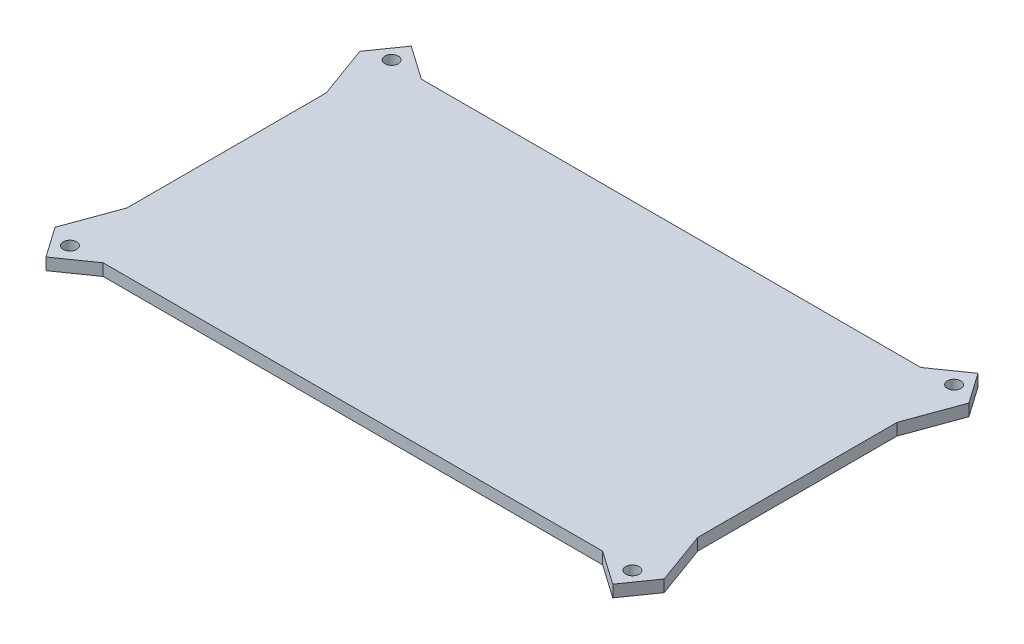
ISO-10303-21;
HEADER;
FILE_DESCRIPTION(('STEP AP214'),'2;1');
FILE_NAME('part.step','',(''),(''),'','','');
FILE_SCHEMA(('AUTOMOTIVE_DESIGN { 1 0 10303 214 1 1 1 1 }'));
ENDSEC;
DATA;
#1=APPLICATION_CONTEXT('core data for automotive mechanical design processes');
#2=APPLICATION_PROTOCOL_DEFINITION('international standard','automotive_design',2000,#1);
#3=PRODUCT_CONTEXT('',#1,'mechanical');
#4=PRODUCT('Part','Part','',(#3));
#5=PRODUCT_RELATED_PRODUCT_CATEGORY('part','',(#4));
#6=PRODUCT_DEFINITION_FORMATION('','',#4);
#7=PRODUCT_DEFINITION_CONTEXT('part definition',#1,'design');
#8=PRODUCT_DEFINITION('design','',#6,#7);
#9=PRODUCT_DEFINITION_SHAPE('','',#8);
#10=(LENGTH_UNIT() NAMED_UNIT(*) SI_UNIT(.MILLI.,.METRE.));
#11=(NAMED_UNIT(*) PLANE_ANGLE_UNIT() SI_UNIT($,.RADIAN.));
#12=(NAMED_UNIT(*) SI_UNIT($,.STERADIAN.) SOLID_ANGLE_UNIT());
#13=UNCERTAINTY_MEASURE_WITH_UNIT(LENGTH_MEASURE(1.E-05),#10,'distance_accuracy_value','');
#14=(GEOMETRIC_REPRESENTATION_CONTEXT(3) GLOBAL_UNCERTAINTY_ASSIGNED_CONTEXT((#13)) GLOBAL_UNIT_ASSIGNED_CONTEXT((#10,
#11,#12)) REPRESENTATION_CONTEXT('',''));
#15=CARTESIAN_POINT('',(0.,0.,0.));
#16=DIRECTION('',(0.,0.,1.));
#17=DIRECTION('',(1.,0.,0.));
#18=AXIS2_PLACEMENT_3D('',#15,#16,#17);
#19=CARTESIAN_POINT('',(0.,0.,0.));
#20=DIRECTION('',(0.,1.,0.));
#21=DIRECTION('',(0.,0.,1.));
#22=AXIS2_PLACEMENT_3D('',#19,#20,#21);
#23=PLANE('',#22);
#24=CARTESIAN_POINT('',(150.291513342091,0.,-85.9398685180908));
#25=DIRECTION('',(0.,-1.,0.));
#26=DIRECTION('',(0.,0.,-1.));
#27=AXIS2_PLACEMENT_3D('',#24,#25,#26);
#28=CIRCLE('',#27,3.57124);
#29=CARTESIAN_POINT('',(150.291513342091,0.,-89.5111085180908));
#30=VERTEX_POINT('',#29);
#31=EDGE_CURVE('E365',#30,#30,#28,.T.);
#32=ORIENTED_EDGE('',*,*,#31,.T.);
#33=EDGE_LOOP('',(#32));
#34=FACE_BOUND('',#33,.T.);
#35=CARTESIAN_POINT('',(-150.291513342091,0.,-85.9398685180908));
#36=DIRECTION('',(0.,-1.,0.));
#37=DIRECTION('',(0.,0.,-1.));
#38=AXIS2_PLACEMENT_3D('',#35,#36,#37);
#39=CIRCLE('',#38,3.57124);
#40=CARTESIAN_POINT('',(-150.291513342091,0.,-89.5111085180908));
#41=VERTEX_POINT('',#40);
#42=EDGE_CURVE('E359',#41,#41,#39,.T.);
#43=ORIENTED_EDGE('',*,*,#42,.T.);
#44=EDGE_LOOP('',(#43));
#45=FACE_BOUND('',#44,.T.);
#46=CARTESIAN_POINT('',(-150.291513342091,0.,85.9398685180908));
#47=DIRECTION('',(0.,-1.,0.));
#48=DIRECTION('',(0.,0.,-1.));
#49=AXIS2_PLACEMENT_3D('',#46,#47,#48);
#50=CIRCLE('',#49,3.57124);
#51=CARTESIAN_POINT('',(-150.291513342091,0.,82.3686285180908));
#52=VERTEX_POINT('',#51);
#53=EDGE_CURVE('E353',#52,#52,#50,.T.);
#54=ORIENTED_EDGE('',*,*,#53,.T.);
#55=EDGE_LOOP('',(#54));
#56=FACE_BOUND('',#55,.T.);
#57=DIRECTION('',(-0.819152044288995,0.,0.573576436351042));
#58=VECTOR('',#57,1.);
#59=CARTESIAN_POINT('',(-133.450000054,0.,85.000000053));
#60=LINE('',#59,#58);
#61=CARTESIAN_POINT('',(-133.450000054,0.,85.000000053));
#62=VERTEX_POINT('',#61);
#63=CARTESIAN_POINT('',(-151.434357400412,0.,97.5927826368149));
#64=VERTEX_POINT('',#63);
#65=EDGE_CURVE('E181',#62,#64,#60,.T.);
#66=ORIENTED_EDGE('',*,*,#65,.F.);
#67=DIRECTION('',(1.,0.,0.));
#68=VECTOR('',#67,1.);
#69=CARTESIAN_POINT('',(-152.500000054,0.,85.000000053));
#70=LINE('',#69,#68);
#71=CARTESIAN_POINT('',(133.450000054,0.,85.000000053));
#72=VERTEX_POINT('',#71);
#73=EDGE_CURVE('E59',#62,#72,#70,.T.);
#74=ORIENTED_EDGE('',*,*,#73,.T.);
#75=DIRECTION('',(-0.819152044288995,0.,-0.573576436351042));
#76=VECTOR('',#75,1.);
#77=CARTESIAN_POINT('',(151.434357400412,0.,97.5927826368149));
#78=LINE('',#77,#76);
#79=CARTESIAN_POINT('',(151.434357400412,0.,97.5927826368149));
#80=VERTEX_POINT('',#79);
#81=EDGE_CURVE('E260',#80,#72,#78,.T.);
#82=ORIENTED_EDGE('',*,*,#81,.F.);
#83=DIRECTION('',(-0.573576436351042,0.,0.819152044288995));
#84=VECTOR('',#83,1.);
#85=CARTESIAN_POINT('',(162.754963749629,0.,81.4252812440682));
#86=LINE('',#85,#84);
#87=CARTESIAN_POINT('',(162.754963749629,0.,81.4252812440682));
#88=VERTEX_POINT('',#87);
#89=EDGE_CURVE('E267',#88,#80,#86,.T.);
#90=ORIENTED_EDGE('',*,*,#89,.F.);
#91=DIRECTION('',(0.342020143325669,0.,0.939692620785908));
#92=VECTOR('',#91,1.);
#93=CARTESIAN_POINT('',(152.500000054,0.,53.250000053));
#94=LINE('',#93,#92);
#95=CARTESIAN_POINT('',(152.500000054,0.,53.250000053));
#96=VERTEX_POINT('',#95);
#97=EDGE_CURVE('E263',#96,#88,#94,.T.);
#98=ORIENTED_EDGE('',*,*,#97,.F.);
#99=DIRECTION('',(0.,0.,-1.));
#100=VECTOR('',#99,1.);
#101=CARTESIAN_POINT('',(152.500000054,0.,-85.000000053));
#102=LINE('',#101,#100);
#103=CARTESIAN_POINT('',(152.500000054,0.,-53.250000053));
#104=VERTEX_POINT('',#103);
#105=EDGE_CURVE('E280',#96,#104,#102,.T.);
#106=ORIENTED_EDGE('',*,*,#105,.T.);
#107=DIRECTION('',(-0.342020143325669,0.,0.939692620785908));
#108=VECTOR('',#107,1.);
#109=CARTESIAN_POINT('',(162.754963749629,0.,-81.4252812440682));
#110=LINE('',#109,#108);
#111=CARTESIAN_POINT('',(162.754963749629,0.,-81.4252812440682));
#112=VERTEX_POINT('',#111);
#113=EDGE_CURVE('E232',#112,#104,#110,.T.);
#114=ORIENTED_EDGE('',*,*,#113,.F.);
#115=DIRECTION('',(0.573576436351042,0.,0.819152044288995));
#116=VECTOR('',#115,1.);
#117=CARTESIAN_POINT('',(151.434357400412,0.,-97.5927826368149));
#118=LINE('',#117,#116);
#119=CARTESIAN_POINT('',(151.434357400412,0.,-97.5927826368149));
#120=VERTEX_POINT('',#119);
#121=EDGE_CURVE('E239',#120,#112,#118,.T.);
#122=ORIENTED_EDGE('',*,*,#121,.F.);
#123=DIRECTION('',(0.819152044288995,0.,-0.573576436351042));
#124=VECTOR('',#123,1.);
#125=CARTESIAN_POINT('',(133.450000054,0.,-85.000000053));
#126=LINE('',#125,#124);
#127=CARTESIAN_POINT('',(133.450000054,0.,-85.000000053));
#128=VERTEX_POINT('',#127);
#129=EDGE_CURVE('E235',#128,#120,#126,.T.);
#130=ORIENTED_EDGE('',*,*,#129,.F.);
#131=DIRECTION('',(-1.,0.,0.));
#132=VECTOR('',#131,1.);
#133=CARTESIAN_POINT('',(-152.500000054,0.,-85.000000053));
#134=LINE('',#133,#132);
#135=CARTESIAN_POINT('',(-133.450000054,0.,-85.000000053));
#136=VERTEX_POINT('',#135);
#137=EDGE_CURVE('E294',#128,#136,#134,.T.);
#138=ORIENTED_EDGE('',*,*,#137,.T.);
#139=DIRECTION('',(0.819152044288995,0.,0.573576436351042));
#140=VECTOR('',#139,1.);
#141=CARTESIAN_POINT('',(-151.434357400412,0.,-97.5927826368149));
#142=LINE('',#141,#140);
#143=CARTESIAN_POINT('',(-151.434357400412,0.,-97.5927826368149));
#144=VERTEX_POINT('',#143);
#145=EDGE_CURVE('E205',#144,#136,#142,.T.);
#146=ORIENTED_EDGE('',*,*,#145,.F.);
#147=DIRECTION('',(0.573576436351042,0.,-0.819152044288995));
#148=VECTOR('',#147,1.);
#149=CARTESIAN_POINT('',(-162.754963749629,0.,-81.4252812440682));
#150=LINE('',#149,#148);
#151=CARTESIAN_POINT('',(-162.754963749629,0.,-81.4252812440682));
#152=VERTEX_POINT('',#151);
#153=EDGE_CURVE('E212',#152,#144,#150,.T.);
#154=ORIENTED_EDGE('',*,*,#153,.F.);
#155=DIRECTION('',(-0.34202014332567,0.,-0.939692620785908));
#156=VECTOR('',#155,1.);
#157=CARTESIAN_POINT('',(-152.500000054,0.,-53.250000053));
#158=LINE('',#157,#156);
#159=CARTESIAN_POINT('',(-152.500000054,0.,-53.250000053));
#160=VERTEX_POINT('',#159);
#161=EDGE_CURVE('E208',#160,#152,#158,.T.);
#162=ORIENTED_EDGE('',*,*,#161,.F.);
#163=DIRECTION('',(0.,0.,1.));
#164=VECTOR('',#163,1.);
#165=CARTESIAN_POINT('',(-152.500000054,0.,-85.000000053));
#166=LINE('',#165,#164);
#167=CARTESIAN_POINT('',(-152.500000054,0.,53.250000053));
#168=VERTEX_POINT('',#167);
#169=EDGE_CURVE('E296',#160,#168,#166,.T.);
#170=ORIENTED_EDGE('',*,*,#169,.T.);
#171=DIRECTION('',(0.342020143325669,0.,-0.939692620785908));
#172=VECTOR('',#171,1.);
#173=CARTESIAN_POINT('',(-162.754963749629,0.,81.4252812440682));
#174=LINE('',#173,#172);
#175=CARTESIAN_POINT('',(-162.754963749629,0.,81.4252812440682));
#176=VERTEX_POINT('',#175);
#177=EDGE_CURVE('E184',#176,#168,#174,.T.);
#178=ORIENTED_EDGE('',*,*,#177,.F.);
#179=DIRECTION('',(-0.573576436351042,0.,-0.819152044288995));
#180=VECTOR('',#179,1.);
#181=CARTESIAN_POINT('',(-151.434357400412,0.,97.5927826368149));
#182=LINE('',#181,#180);
#183=EDGE_CURVE('E172',#64,#176,#182,.T.);
#184=ORIENTED_EDGE('',*,*,#183,.F.);
#185=EDGE_LOOP('',(#66,#74,#82,#90,#98,#106,#114,#122,#130,#138,#146,#154,#162,#170,#178,#184));
#186=FACE_BOUND('',#185,.T.);
#187=CARTESIAN_POINT('',(150.291513342091,0.,85.9398685180908));
#188=DIRECTION('',(0.,-1.,0.));
#189=DIRECTION('',(0.,0.,-1.));
#190=AXIS2_PLACEMENT_3D('',#187,#188,#189);
#191=CIRCLE('',#190,3.57124);
#192=CARTESIAN_POINT('',(150.291513342091,0.,82.3686285180908));
#193=VERTEX_POINT('',#192);
#194=EDGE_CURVE('E199',#193,#193,#191,.T.);
#195=ORIENTED_EDGE('',*,*,#194,.T.);
#196=EDGE_LOOP('',(#195));
#197=FACE_BOUND('',#196,.T.);
#198=ADVANCED_FACE('F55',(#34,#45,#56,#186,#197),#23,.T.);
#199=CARTESIAN_POINT('',(152.500000054,-6.35,-85.000000053));
#200=DIRECTION('',(1.,0.,0.));
#201=DIRECTION('',(0.,0.,-1.));
#202=AXIS2_PLACEMENT_3D('',#199,#200,#201);
#203=PLANE('',#202);
#204=DIRECTION('',(0.,-1.,0.));
#205=VECTOR('',#204,1.);
#206=CARTESIAN_POINT('',(152.500000054,0.,-53.250000053));
#207=LINE('',#206,#205);
#208=CARTESIAN_POINT('',(152.500000054,-6.35,-53.250000053));
#209=VERTEX_POINT('',#208);
#210=EDGE_CURVE('E242',#104,#209,#207,.T.);
#211=ORIENTED_EDGE('',*,*,#210,.F.);
#212=ORIENTED_EDGE('',*,*,#105,.F.);
#213=DIRECTION('',(0.,-1.,0.));
#214=VECTOR('',#213,1.);
#215=CARTESIAN_POINT('',(152.500000054,0.,53.250000053));
#216=LINE('',#215,#214);
#217=CARTESIAN_POINT('',(152.500000054,-6.35,53.250000053));
#218=VERTEX_POINT('',#217);
#219=EDGE_CURVE('E283',#96,#218,#216,.T.);
#220=ORIENTED_EDGE('',*,*,#219,.T.);
#221=DIRECTION('',(0.,0.,-1.));
#222=VECTOR('',#221,1.);
#223=CARTESIAN_POINT('',(152.500000054,-6.35,-85.000000053));
#224=LINE('',#223,#222);
#225=EDGE_CURVE('E287',#218,#209,#224,.T.);
#226=ORIENTED_EDGE('',*,*,#225,.T.);
#227=EDGE_LOOP('',(#211,#212,#220,#226));
#228=FACE_BOUND('',#227,.T.);
#229=ADVANCED_FACE('F57',(#228),#203,.T.);
#230=CARTESIAN_POINT('',(-152.500000054,-6.35,85.000000053));
#231=DIRECTION('',(0.,0.,1.));
#232=DIRECTION('',(1.,0.,0.));
#233=AXIS2_PLACEMENT_3D('',#230,#231,#232);
#234=PLANE('',#233);
#235=DIRECTION('',(0.,-1.,0.));
#236=VECTOR('',#235,1.);
#237=CARTESIAN_POINT('',(-133.450000054,0.,85.000000053));
#238=LINE('',#237,#236);
#239=CARTESIAN_POINT('',(-133.450000054,-6.35,85.000000053));
#240=VERTEX_POINT('',#239);
#241=EDGE_CURVE('E71',#62,#240,#238,.T.);
#242=ORIENTED_EDGE('',*,*,#241,.T.);
#243=DIRECTION('',(1.,0.,0.));
#244=VECTOR('',#243,1.);
#245=CARTESIAN_POINT('',(-152.500000054,-6.35,85.000000053));
#246=LINE('',#245,#244);
#247=CARTESIAN_POINT('',(133.450000054,-6.35,85.000000053));
#248=VERTEX_POINT('',#247);
#249=EDGE_CURVE('E12',#240,#248,#246,.T.);
#250=ORIENTED_EDGE('',*,*,#249,.T.);
#251=DIRECTION('',(0.,-1.,0.));
#252=VECTOR('',#251,1.);
#253=CARTESIAN_POINT('',(133.450000054,0.,85.000000053));
#254=LINE('',#253,#252);
#255=EDGE_CURVE('E270',#72,#248,#254,.T.);
#256=ORIENTED_EDGE('',*,*,#255,.F.);
#257=ORIENTED_EDGE('',*,*,#73,.F.);
#258=EDGE_LOOP('',(#242,#250,#256,#257));
#259=FACE_BOUND('',#258,.T.);
#260=ADVANCED_FACE('F301',(#259),#234,.T.);
#261=CARTESIAN_POINT('',(-152.500000054,-6.35,-85.000000053));
#262=DIRECTION('',(-1.,0.,0.));
#263=DIRECTION('',(0.,0.,1.));
#264=AXIS2_PLACEMENT_3D('',#261,#262,#263);
#265=PLANE('',#264);
#266=DIRECTION('',(0.,-1.,0.));
#267=VECTOR('',#266,1.);
#268=CARTESIAN_POINT('',(-152.500000054,0.,53.250000053));
#269=LINE('',#268,#267);
#270=CARTESIAN_POINT('',(-152.500000054,-6.35,53.250000053));
#271=VERTEX_POINT('',#270);
#272=EDGE_CURVE('E190',#168,#271,#269,.T.);
#273=ORIENTED_EDGE('',*,*,#272,.F.);
#274=ORIENTED_EDGE('',*,*,#169,.F.);
#275=DIRECTION('',(0.,-1.,0.));
#276=VECTOR('',#275,1.);
#277=CARTESIAN_POINT('',(-152.500000054,0.,-53.250000053));
#278=LINE('',#277,#276);
#279=CARTESIAN_POINT('',(-152.500000054,-6.35,-53.250000053));
#280=VERTEX_POINT('',#279);
#281=EDGE_CURVE('E228',#160,#280,#278,.T.);
#282=ORIENTED_EDGE('',*,*,#281,.T.);
#283=DIRECTION('',(0.,0.,1.));
#284=VECTOR('',#283,1.);
#285=CARTESIAN_POINT('',(-152.500000054,-6.35,-85.000000053));
#286=LINE('',#285,#284);
#287=EDGE_CURVE('E64',#280,#271,#286,.T.);
#288=ORIENTED_EDGE('',*,*,#287,.T.);
#289=EDGE_LOOP('',(#273,#274,#282,#288));
#290=FACE_BOUND('',#289,.T.);
#291=ADVANCED_FACE('F343',(#290),#265,.T.);
#292=CARTESIAN_POINT('',(-152.500000054,-6.35,-85.000000053));
#293=DIRECTION('',(0.,0.,-1.));
#294=DIRECTION('',(-1.,0.,0.));
#295=AXIS2_PLACEMENT_3D('',#292,#293,#294);
#296=PLANE('',#295);
#297=DIRECTION('',(0.,-1.,0.));
#298=VECTOR('',#297,1.);
#299=CARTESIAN_POINT('',(-133.450000054,0.,-85.000000053));
#300=LINE('',#299,#298);
#301=CARTESIAN_POINT('',(-133.450000054,-6.35,-85.000000053));
#302=VERTEX_POINT('',#301);
#303=EDGE_CURVE('E215',#136,#302,#300,.T.);
#304=ORIENTED_EDGE('',*,*,#303,.F.);
#305=ORIENTED_EDGE('',*,*,#137,.F.);
#306=DIRECTION('',(0.,-1.,0.));
#307=VECTOR('',#306,1.);
#308=CARTESIAN_POINT('',(133.450000054,0.,-85.000000053));
#309=LINE('',#308,#307);
#310=CARTESIAN_POINT('',(133.450000054,-6.35,-85.000000053));
#311=VERTEX_POINT('',#310);
#312=EDGE_CURVE('E255',#128,#311,#309,.T.);
#313=ORIENTED_EDGE('',*,*,#312,.T.);
#314=DIRECTION('',(-1.,0.,0.));
#315=VECTOR('',#314,1.);
#316=CARTESIAN_POINT('',(-152.500000054,-6.35,-85.000000053));
#317=LINE('',#316,#315);
#318=EDGE_CURVE('E289',#311,#302,#317,.T.);
#319=ORIENTED_EDGE('',*,*,#318,.T.);
#320=EDGE_LOOP('',(#304,#305,#313,#319));
#321=FACE_BOUND('',#320,.T.);
#322=ADVANCED_FACE('F376',(#321),#296,.T.);
#323=CARTESIAN_POINT('',(0.,-6.35,0.));
#324=DIRECTION('',(0.,1.,0.));
#325=DIRECTION('',(0.,0.,1.));
#326=AXIS2_PLACEMENT_3D('',#323,#324,#325);
#327=PLANE('',#326);
#328=CARTESIAN_POINT('',(150.291513342091,-6.35,-85.9398685180908));
#329=DIRECTION('',(0.,-1.,0.));
#330=DIRECTION('',(0.,0.,-1.));
#331=AXIS2_PLACEMENT_3D('',#328,#329,#330);
#332=CIRCLE('',#331,3.57123999999998);
#333=CARTESIAN_POINT('',(150.291513342091,-6.35,-89.5111085180907));
#334=VERTEX_POINT('',#333);
#335=EDGE_CURVE('E368',#334,#334,#332,.T.);
#336=ORIENTED_EDGE('',*,*,#335,.F.);
#337=EDGE_LOOP('',(#336));
#338=FACE_BOUND('',#337,.T.);
#339=CARTESIAN_POINT('',(-150.291513342091,-6.35,-85.9398685180908));
#340=DIRECTION('',(0.,-1.,0.));
#341=DIRECTION('',(0.,0.,-1.));
#342=AXIS2_PLACEMENT_3D('',#339,#340,#341);
#343=CIRCLE('',#342,3.57123999999998);
#344=CARTESIAN_POINT('',(-150.291513342091,-6.35,-89.5111085180907));
#345=VERTEX_POINT('',#344);
#346=EDGE_CURVE('E362',#345,#345,#343,.T.);
#347=ORIENTED_EDGE('',*,*,#346,.F.);
#348=EDGE_LOOP('',(#347));
#349=FACE_BOUND('',#348,.T.);
#350=CARTESIAN_POINT('',(-150.291513342091,-6.35,85.9398685180908));
#351=DIRECTION('',(0.,-1.,0.));
#352=DIRECTION('',(0.,0.,-1.));
#353=AXIS2_PLACEMENT_3D('',#350,#351,#352);
#354=CIRCLE('',#353,3.57123999999998);
#355=CARTESIAN_POINT('',(-150.291513342091,-6.35,82.3686285180908));
#356=VERTEX_POINT('',#355);
#357=EDGE_CURVE('E356',#356,#356,#354,.T.);
#358=ORIENTED_EDGE('',*,*,#357,.F.);
#359=EDGE_LOOP('',(#358));
#360=FACE_BOUND('',#359,.T.);
#361=CARTESIAN_POINT('',(150.291513342091,-6.35,85.9398685180908));
#362=DIRECTION('',(0.,-1.,0.));
#363=DIRECTION('',(0.,0.,-1.));
#364=AXIS2_PLACEMENT_3D('',#361,#362,#363);
#365=CIRCLE('',#364,3.57123999999998);
#366=CARTESIAN_POINT('',(150.291513342091,-6.35,82.3686285180908));
#367=VERTEX_POINT('',#366);
#368=EDGE_CURVE('E350',#367,#367,#365,.T.);
#369=ORIENTED_EDGE('',*,*,#368,.F.);
#370=EDGE_LOOP('',(#369));
#371=FACE_BOUND('',#370,.T.);
#372=ORIENTED_EDGE('',*,*,#249,.F.);
#373=DIRECTION('',(-0.819152044288995,0.,0.573576436351042));
#374=VECTOR('',#373,1.);
#375=CARTESIAN_POINT('',(-133.450000054,-6.35,85.000000053));
#376=LINE('',#375,#374);
#377=CARTESIAN_POINT('',(-151.434357400412,-6.35,97.5927826368149));
#378=VERTEX_POINT('',#377);
#379=EDGE_CURVE('E198',#240,#378,#376,.T.);
#380=ORIENTED_EDGE('',*,*,#379,.T.);
#381=DIRECTION('',(-0.573576436351042,0.,-0.819152044288995));
#382=VECTOR('',#381,1.);
#383=CARTESIAN_POINT('',(-151.434357400412,-6.35,97.5927826368149));
#384=LINE('',#383,#382);
#385=CARTESIAN_POINT('',(-162.754963749629,-6.35,81.4252812440682));
#386=VERTEX_POINT('',#385);
#387=EDGE_CURVE('E174',#378,#386,#384,.T.);
#388=ORIENTED_EDGE('',*,*,#387,.T.);
#389=DIRECTION('',(0.342020143325669,0.,-0.939692620785908));
#390=VECTOR('',#389,1.);
#391=CARTESIAN_POINT('',(-162.754963749629,-6.35,81.4252812440682));
#392=LINE('',#391,#390);
#393=EDGE_CURVE('E195',#386,#271,#392,.T.);
#394=ORIENTED_EDGE('',*,*,#393,.T.);
#395=ORIENTED_EDGE('',*,*,#287,.F.);
#396=DIRECTION('',(-0.34202014332567,0.,-0.939692620785908));
#397=VECTOR('',#396,1.);
#398=CARTESIAN_POINT('',(-152.500000054,-6.35,-53.250000053));
#399=LINE('',#398,#397);
#400=CARTESIAN_POINT('',(-162.754963749629,-6.35,-81.4252812440682));
#401=VERTEX_POINT('',#400);
#402=EDGE_CURVE('E218',#280,#401,#399,.T.);
#403=ORIENTED_EDGE('',*,*,#402,.T.);
#404=DIRECTION('',(0.573576436351042,0.,-0.819152044288995));
#405=VECTOR('',#404,1.);
#406=CARTESIAN_POINT('',(-162.754963749629,-6.35,-81.4252812440682));
#407=LINE('',#406,#405);
#408=CARTESIAN_POINT('',(-151.434357400412,-6.35,-97.5927826368149));
#409=VERTEX_POINT('',#408);
#410=EDGE_CURVE('E209',#401,#409,#407,.T.);
#411=ORIENTED_EDGE('',*,*,#410,.T.);
#412=DIRECTION('',(0.819152044288995,0.,0.573576436351042));
#413=VECTOR('',#412,1.);
#414=CARTESIAN_POINT('',(-151.434357400412,-6.35,-97.5927826368149));
#415=LINE('',#414,#413);
#416=EDGE_CURVE('E202',#409,#302,#415,.T.);
#417=ORIENTED_EDGE('',*,*,#416,.T.);
#418=ORIENTED_EDGE('',*,*,#318,.F.);
#419=DIRECTION('',(0.819152044288995,0.,-0.573576436351042));
#420=VECTOR('',#419,1.);
#421=CARTESIAN_POINT('',(133.450000054,-6.35,-85.000000053));
#422=LINE('',#421,#420);
#423=CARTESIAN_POINT('',(151.434357400412,-6.35,-97.5927826368149));
#424=VERTEX_POINT('',#423);
#425=EDGE_CURVE('E245',#311,#424,#422,.T.);
#426=ORIENTED_EDGE('',*,*,#425,.T.);
#427=DIRECTION('',(0.573576436351042,0.,0.819152044288995));
#428=VECTOR('',#427,1.);
#429=CARTESIAN_POINT('',(151.434357400412,-6.35,-97.5927826368149));
#430=LINE('',#429,#428);
#431=CARTESIAN_POINT('',(162.754963749629,-6.35,-81.4252812440682));
#432=VERTEX_POINT('',#431);
#433=EDGE_CURVE('E236',#424,#432,#430,.T.);
#434=ORIENTED_EDGE('',*,*,#433,.T.);
#435=DIRECTION('',(-0.342020143325669,0.,0.939692620785908));
#436=VECTOR('',#435,1.);
#437=CARTESIAN_POINT('',(162.754963749629,-6.35,-81.4252812440682));
#438=LINE('',#437,#436);
#439=EDGE_CURVE('E225',#432,#209,#438,.T.);
#440=ORIENTED_EDGE('',*,*,#439,.T.);
#441=ORIENTED_EDGE('',*,*,#225,.F.);
#442=DIRECTION('',(0.342020143325669,0.,0.939692620785908));
#443=VECTOR('',#442,1.);
#444=CARTESIAN_POINT('',(152.500000054,-6.35,53.250000053));
#445=LINE('',#444,#443);
#446=CARTESIAN_POINT('',(162.754963749629,-6.35,81.4252812440682));
#447=VERTEX_POINT('',#446);
#448=EDGE_CURVE('E273',#218,#447,#445,.T.);
#449=ORIENTED_EDGE('',*,*,#448,.T.);
#450=DIRECTION('',(-0.573576436351042,0.,0.819152044288995));
#451=VECTOR('',#450,1.);
#452=CARTESIAN_POINT('',(162.754963749629,-6.35,81.4252812440682));
#453=LINE('',#452,#451);
#454=CARTESIAN_POINT('',(151.434357400412,-6.35,97.5927826368149));
#455=VERTEX_POINT('',#454);
#456=EDGE_CURVE('E264',#447,#455,#453,.T.);
#457=ORIENTED_EDGE('',*,*,#456,.T.);
#458=DIRECTION('',(-0.819152044288995,0.,-0.573576436351042));
#459=VECTOR('',#458,1.);
#460=CARTESIAN_POINT('',(151.434357400412,-6.35,97.5927826368149));
#461=LINE('',#460,#459);
#462=EDGE_CURVE('E252',#455,#248,#461,.T.);
#463=ORIENTED_EDGE('',*,*,#462,.T.);
#464=EDGE_LOOP('',(#372,#380,#388,#394,#395,#403,#411,#417,#418,#426,#434,#440,#441,#449,#457,#463));
#465=FACE_BOUND('',#464,.T.);
#466=ADVANCED_FACE('F317',(#338,#349,#360,#371,#465),#327,.F.);
#467=CARTESIAN_POINT('',(151.434357400412,0.,97.5927826368149));
#468=DIRECTION('',(-0.573576436351042,0.,0.819152044288995));
#469=DIRECTION('',(0.819152044288995,0.,0.573576436351042));
#470=AXIS2_PLACEMENT_3D('',#467,#468,#469);
#471=PLANE('',#470);
#472=ORIENTED_EDGE('',*,*,#462,.F.);
#473=DIRECTION('',(0.,-1.,0.));
#474=VECTOR('',#473,1.);
#475=CARTESIAN_POINT('',(151.434357400412,0.,97.5927826368149));
#476=LINE('',#475,#474);
#477=EDGE_CURVE('E278',#80,#455,#476,.T.);
#478=ORIENTED_EDGE('',*,*,#477,.F.);
#479=ORIENTED_EDGE('',*,*,#81,.T.);
#480=ORIENTED_EDGE('',*,*,#255,.T.);
#481=EDGE_LOOP('',(#472,#478,#479,#480));
#482=FACE_BOUND('',#481,.T.);
#483=ADVANCED_FACE('F304',(#482),#471,.T.);
#484=CARTESIAN_POINT('',(162.754963749629,0.,81.4252812440682));
#485=DIRECTION('',(0.819152044288995,0.,0.573576436351042));
#486=DIRECTION('',(0.573576436351042,0.,-0.819152044288995));
#487=AXIS2_PLACEMENT_3D('',#484,#485,#486);
#488=PLANE('',#487);
#489=ORIENTED_EDGE('',*,*,#456,.F.);
#490=DIRECTION('',(0.,-1.,0.));
#491=VECTOR('',#490,1.);
#492=CARTESIAN_POINT('',(162.754963749629,0.,81.4252812440682));
#493=LINE('',#492,#491);
#494=EDGE_CURVE('E281',#88,#447,#493,.T.);
#495=ORIENTED_EDGE('',*,*,#494,.F.);
#496=ORIENTED_EDGE('',*,*,#89,.T.);
#497=ORIENTED_EDGE('',*,*,#477,.T.);
#498=EDGE_LOOP('',(#489,#495,#496,#497));
#499=FACE_BOUND('',#498,.T.);
#500=ADVANCED_FACE('F307',(#499),#488,.T.);
#501=CARTESIAN_POINT('',(152.500000054,0.,53.250000053));
#502=DIRECTION('',(0.939692620785908,0.,-0.342020143325669));
#503=DIRECTION('',(-0.342020143325669,0.,-0.939692620785908));
#504=AXIS2_PLACEMENT_3D('',#501,#502,#503);
#505=PLANE('',#504);
#506=ORIENTED_EDGE('',*,*,#448,.F.);
#507=ORIENTED_EDGE('',*,*,#219,.F.);
#508=ORIENTED_EDGE('',*,*,#97,.T.);
#509=ORIENTED_EDGE('',*,*,#494,.T.);
#510=EDGE_LOOP('',(#506,#507,#508,#509));
#511=FACE_BOUND('',#510,.T.);
#512=ADVANCED_FACE('F313',(#511),#505,.T.);
#513=CARTESIAN_POINT('',(162.754963749629,0.,-81.4252812440682));
#514=DIRECTION('',(0.939692620785908,0.,0.342020143325669));
#515=DIRECTION('',(0.342020143325669,0.,-0.939692620785908));
#516=AXIS2_PLACEMENT_3D('',#513,#514,#515);
#517=PLANE('',#516);
#518=ORIENTED_EDGE('',*,*,#439,.F.);
#519=DIRECTION('',(0.,-1.,0.));
#520=VECTOR('',#519,1.);
#521=CARTESIAN_POINT('',(162.754963749629,0.,-81.4252812440682));
#522=LINE('',#521,#520);
#523=EDGE_CURVE('E250',#112,#432,#522,.T.);
#524=ORIENTED_EDGE('',*,*,#523,.F.);
#525=ORIENTED_EDGE('',*,*,#113,.T.);
#526=ORIENTED_EDGE('',*,*,#210,.T.);
#527=EDGE_LOOP('',(#518,#524,#525,#526));
#528=FACE_BOUND('',#527,.T.);
#529=ADVANCED_FACE('F321',(#528),#517,.T.);
#530=CARTESIAN_POINT('',(151.434357400412,0.,-97.5927826368149));
#531=DIRECTION('',(0.819152044288995,0.,-0.573576436351042));
#532=DIRECTION('',(-0.573576436351042,0.,-0.819152044288995));
#533=AXIS2_PLACEMENT_3D('',#530,#531,#532);
#534=PLANE('',#533);
#535=ORIENTED_EDGE('',*,*,#433,.F.);
#536=DIRECTION('',(0.,-1.,0.));
#537=VECTOR('',#536,1.);
#538=CARTESIAN_POINT('',(151.434357400412,0.,-97.5927826368149));
#539=LINE('',#538,#537);
#540=EDGE_CURVE('E253',#120,#424,#539,.T.);
#541=ORIENTED_EDGE('',*,*,#540,.F.);
#542=ORIENTED_EDGE('',*,*,#121,.T.);
#543=ORIENTED_EDGE('',*,*,#523,.T.);
#544=EDGE_LOOP('',(#535,#541,#542,#543));
#545=FACE_BOUND('',#544,.T.);
#546=ADVANCED_FACE('F325',(#545),#534,.T.);
#547=CARTESIAN_POINT('',(133.450000054,0.,-85.000000053));
#548=DIRECTION('',(-0.573576436351042,0.,-0.819152044288995));
#549=DIRECTION('',(-0.819152044288995,0.,0.573576436351042));
#550=AXIS2_PLACEMENT_3D('',#547,#548,#549);
#551=PLANE('',#550);
#552=ORIENTED_EDGE('',*,*,#425,.F.);
#553=ORIENTED_EDGE('',*,*,#312,.F.);
#554=ORIENTED_EDGE('',*,*,#129,.T.);
#555=ORIENTED_EDGE('',*,*,#540,.T.);
#556=EDGE_LOOP('',(#552,#553,#554,#555));
#557=FACE_BOUND('',#556,.T.);
#558=ADVANCED_FACE('F329',(#557),#551,.T.);
#559=CARTESIAN_POINT('',(-151.434357400412,0.,-97.5927826368149));
#560=DIRECTION('',(0.573576436351042,0.,-0.819152044288995));
#561=DIRECTION('',(-0.819152044288995,0.,-0.573576436351042));
#562=AXIS2_PLACEMENT_3D('',#559,#560,#561);
#563=PLANE('',#562);
#564=ORIENTED_EDGE('',*,*,#416,.F.);
#565=DIRECTION('',(0.,-1.,0.));
#566=VECTOR('',#565,1.);
#567=CARTESIAN_POINT('',(-151.434357400412,0.,-97.5927826368149));
#568=LINE('',#567,#566);
#569=EDGE_CURVE('E223',#144,#409,#568,.T.);
#570=ORIENTED_EDGE('',*,*,#569,.F.);
#571=ORIENTED_EDGE('',*,*,#145,.T.);
#572=ORIENTED_EDGE('',*,*,#303,.T.);
#573=EDGE_LOOP('',(#564,#570,#571,#572));
#574=FACE_BOUND('',#573,.T.);
#575=ADVANCED_FACE('F335',(#574),#563,.T.);
#576=CARTESIAN_POINT('',(-162.754963749629,0.,-81.4252812440682));
#577=DIRECTION('',(-0.819152044288995,0.,-0.573576436351042));
#578=DIRECTION('',(-0.573576436351042,0.,0.819152044288995));
#579=AXIS2_PLACEMENT_3D('',#576,#577,#578);
#580=PLANE('',#579);
#581=ORIENTED_EDGE('',*,*,#410,.F.);
#582=DIRECTION('',(0.,-1.,0.));
#583=VECTOR('',#582,1.);
#584=CARTESIAN_POINT('',(-162.754963749629,0.,-81.4252812440682));
#585=LINE('',#584,#583);
#586=EDGE_CURVE('E226',#152,#401,#585,.T.);
#587=ORIENTED_EDGE('',*,*,#586,.F.);
#588=ORIENTED_EDGE('',*,*,#153,.T.);
#589=ORIENTED_EDGE('',*,*,#569,.T.);
#590=EDGE_LOOP('',(#581,#587,#588,#589));
#591=FACE_BOUND('',#590,.T.);
#592=ADVANCED_FACE('F338',(#591),#580,.T.);
#593=CARTESIAN_POINT('',(-152.500000054,0.,-53.250000053));
#594=DIRECTION('',(-0.939692620785908,0.,0.34202014332567));
#595=DIRECTION('',(0.34202014332567,0.,0.939692620785908));
#596=AXIS2_PLACEMENT_3D('',#593,#594,#595);
#597=PLANE('',#596);
#598=ORIENTED_EDGE('',*,*,#402,.F.);
#599=ORIENTED_EDGE('',*,*,#281,.F.);
#600=ORIENTED_EDGE('',*,*,#161,.T.);
#601=ORIENTED_EDGE('',*,*,#586,.T.);
#602=EDGE_LOOP('',(#598,#599,#600,#601));
#603=FACE_BOUND('',#602,.T.);
#604=ADVANCED_FACE('F342',(#603),#597,.T.);
#605=CARTESIAN_POINT('',(-162.754963749629,0.,81.4252812440682));
#606=DIRECTION('',(-0.939692620785908,0.,-0.342020143325669));
#607=DIRECTION('',(-0.342020143325669,0.,0.939692620785909));
#608=AXIS2_PLACEMENT_3D('',#605,#606,#607);
#609=PLANE('',#608);
#610=ORIENTED_EDGE('',*,*,#393,.F.);
#611=DIRECTION('',(0.,-1.,0.));
#612=VECTOR('',#611,1.);
#613=CARTESIAN_POINT('',(-162.754963749629,0.,81.4252812440682));
#614=LINE('',#613,#612);
#615=EDGE_CURVE('E178',#176,#386,#614,.T.);
#616=ORIENTED_EDGE('',*,*,#615,.F.);
#617=ORIENTED_EDGE('',*,*,#177,.T.);
#618=ORIENTED_EDGE('',*,*,#272,.T.);
#619=EDGE_LOOP('',(#610,#616,#617,#618));
#620=FACE_BOUND('',#619,.T.);
#621=ADVANCED_FACE('F346',(#620),#609,.T.);
#622=CARTESIAN_POINT('',(-151.434357400412,0.,97.5927826368149));
#623=DIRECTION('',(-0.819152044288995,0.,0.573576436351042));
#624=DIRECTION('',(0.573576436351042,0.,0.819152044288995));
#625=AXIS2_PLACEMENT_3D('',#622,#623,#624);
#626=PLANE('',#625);
#627=ORIENTED_EDGE('',*,*,#387,.F.);
#628=DIRECTION('',(0.,-1.,0.));
#629=VECTOR('',#628,1.);
#630=CARTESIAN_POINT('',(-151.434357400412,0.,97.5927826368149));
#631=LINE('',#630,#629);
#632=EDGE_CURVE('E168',#64,#378,#631,.T.);
#633=ORIENTED_EDGE('',*,*,#632,.F.);
#634=ORIENTED_EDGE('',*,*,#183,.T.);
#635=ORIENTED_EDGE('',*,*,#615,.T.);
#636=EDGE_LOOP('',(#627,#633,#634,#635));
#637=FACE_BOUND('',#636,.T.);
#638=ADVANCED_FACE('F170',(#637),#626,.T.);
#639=CARTESIAN_POINT('',(-133.450000054,0.,85.000000053));
#640=DIRECTION('',(0.573576436351042,0.,0.819152044288995));
#641=DIRECTION('',(0.819152044288995,0.,-0.573576436351042));
#642=AXIS2_PLACEMENT_3D('',#639,#640,#641);
#643=PLANE('',#642);
#644=ORIENTED_EDGE('',*,*,#379,.F.);
#645=ORIENTED_EDGE('',*,*,#241,.F.);
#646=ORIENTED_EDGE('',*,*,#65,.T.);
#647=ORIENTED_EDGE('',*,*,#632,.T.);
#648=EDGE_LOOP('',(#644,#645,#646,#647));
#649=FACE_BOUND('',#648,.T.);
#650=ADVANCED_FACE('F182',(#649),#643,.T.);
#651=CARTESIAN_POINT('',(150.291513342091,-6.35,85.9398685180908));
#652=DIRECTION('',(0.,-1.,0.));
#653=DIRECTION('',(0.,0.,-1.));
#654=AXIS2_PLACEMENT_3D('',#651,#652,#653);
#655=CYLINDRICAL_SURFACE('',#654,3.57123999999999);
#656=ORIENTED_EDGE('',*,*,#194,.F.);
#657=EDGE_LOOP('',(#656));
#658=FACE_BOUND('',#657,.T.);
#659=ORIENTED_EDGE('',*,*,#368,.T.);
#660=EDGE_LOOP('',(#659));
#661=FACE_BOUND('',#660,.T.);
#662=ADVANCED_FACE('F384',(#658,#661),#655,.F.);
#663=CARTESIAN_POINT('',(-150.291513342091,-6.35,85.9398685180908));
#664=DIRECTION('',(0.,-1.,0.));
#665=DIRECTION('',(0.,0.,-1.));
#666=AXIS2_PLACEMENT_3D('',#663,#664,#665);
#667=CYLINDRICAL_SURFACE('',#666,3.57123999999999);
#668=ORIENTED_EDGE('',*,*,#53,.F.);
#669=EDGE_LOOP('',(#668));
#670=FACE_BOUND('',#669,.T.);
#671=ORIENTED_EDGE('',*,*,#357,.T.);
#672=EDGE_LOOP('',(#671));
#673=FACE_BOUND('',#672,.T.);
#674=ADVANCED_FACE('F386',(#670,#673),#667,.F.);
#675=CARTESIAN_POINT('',(-150.291513342091,-6.35,-85.9398685180908));
#676=DIRECTION('',(0.,-1.,0.));
#677=DIRECTION('',(0.,0.,-1.));
#678=AXIS2_PLACEMENT_3D('',#675,#676,#677);
#679=CYLINDRICAL_SURFACE('',#678,3.57123999999999);
#680=ORIENTED_EDGE('',*,*,#42,.F.);
#681=EDGE_LOOP('',(#680));
#682=FACE_BOUND('',#681,.T.);
#683=ORIENTED_EDGE('',*,*,#346,.T.);
#684=EDGE_LOOP('',(#683));
#685=FACE_BOUND('',#684,.T.);
#686=ADVANCED_FACE('F392',(#682,#685),#679,.F.);
#687=CARTESIAN_POINT('',(150.291513342091,-6.35,-85.9398685180908));
#688=DIRECTION('',(0.,-1.,0.));
#689=DIRECTION('',(0.,0.,-1.));
#690=AXIS2_PLACEMENT_3D('',#687,#688,#689);
#691=CYLINDRICAL_SURFACE('',#690,3.57123999999999);
#692=ORIENTED_EDGE('',*,*,#31,.F.);
#693=EDGE_LOOP('',(#692));
#694=FACE_BOUND('',#693,.T.);
#695=ORIENTED_EDGE('',*,*,#335,.T.);
#696=EDGE_LOOP('',(#695));
#697=FACE_BOUND('',#696,.T.);
#698=ADVANCED_FACE('F372',(#694,#697),#691,.F.);
#699=CLOSED_SHELL('',(#198,#229,#260,#291,#322,#466,#483,#500,#512,#529,#546,#558,#575,#592,
#604,#621,#638,#650,#662,#674,#686,#698));
#700=MANIFOLD_SOLID_BREP('B2',#699);
#701=CARTESIAN_POINT('',(0.,-6.35,0.));
#702=DIRECTION('',(0.,1.,0.));
#703=DIRECTION('',(0.,0.,1.));
#704=AXIS2_PLACEMENT_3D('',#701,#702,#703);
#705=PLANE('',#704);
#706=CARTESIAN_POINT('',(78.75778,-6.35,-66.0577799999999));
#707=DIRECTION('',(0.,1.,0.));
#708=DIRECTION('',(0.,0.,1.));
#709=AXIS2_PLACEMENT_3D('',#706,#707,#708);
#710=CIRCLE('',#709,3.3782);
#711=CARTESIAN_POINT('',(78.75778,-6.35,-62.6795799999999));
#712=VERTEX_POINT('',#711);
#713=EDGE_CURVE('E755',#712,#712,#710,.T.);
#714=ORIENTED_EDGE('',*,*,#713,.T.);
#715=EDGE_LOOP('',(#714));
#716=FACE_BOUND('',#715,.T.);
#717=CARTESIAN_POINT('',(78.75778,-6.35,66.0577799999999));
#718=DIRECTION('',(0.,1.,0.));
#719=DIRECTION('',(0.,0.,1.));
#720=AXIS2_PLACEMENT_3D('',#717,#718,#719);
#721=CIRCLE('',#720,3.3782);
#722=CARTESIAN_POINT('',(78.75778,-6.35,69.4359799999999));
#723=VERTEX_POINT('',#722);
#724=EDGE_CURVE('E749',#723,#723,#721,.T.);
#725=ORIENTED_EDGE('',*,*,#724,.T.);
#726=EDGE_LOOP('',(#725));
#727=FACE_BOUND('',#726,.T.);
#728=CARTESIAN_POINT('',(-78.75778,-6.35,-66.0577799999999));
#729=DIRECTION('',(0.,1.,0.));
#730=DIRECTION('',(0.,0.,1.));
#731=AXIS2_PLACEMENT_3D('',#728,#729,#730);
#732=CIRCLE('',#731,3.3782);
#733=CARTESIAN_POINT('',(-78.75778,-6.35,-62.6795799999999));
#734=VERTEX_POINT('',#733);
#735=EDGE_CURVE('E742',#734,#734,#732,.T.);
#736=ORIENTED_EDGE('',*,*,#735,.T.);
#737=EDGE_LOOP('',(#736));
#738=FACE_BOUND('',#737,.T.);
#739=CARTESIAN_POINT('',(-78.75778,-6.35,66.0577799999999));
#740=DIRECTION('',(0.,1.,0.));
#741=DIRECTION('',(0.,0.,1.));
#742=AXIS2_PLACEMENT_3D('',#739,#740,#741);
#743=CIRCLE('',#742,3.3782);
#744=CARTESIAN_POINT('',(-78.75778,-6.35,69.4359799999999));
#745=VERTEX_POINT('',#744);
#746=EDGE_CURVE('E716',#745,#745,#743,.T.);
#747=ORIENTED_EDGE('',*,*,#746,.T.);
#748=EDGE_LOOP('',(#747));
#749=FACE_BOUND('',#748,.T.);
#750=DIRECTION('',(-1.,0.,0.));
#751=VECTOR('',#750,1.);
#752=CARTESIAN_POINT('',(-95.25,-6.35,-82.55));
#753=LINE('',#752,#751);
#754=CARTESIAN_POINT('',(76.2000000000001,-6.35,-82.55));
#755=VERTEX_POINT('',#754);
#756=CARTESIAN_POINT('',(-76.2000000000001,-6.35,-82.55));
#757=VERTEX_POINT('',#756);
#758=EDGE_CURVE('E679',#755,#757,#753,.T.);
#759=ORIENTED_EDGE('',*,*,#758,.F.);
#760=DIRECTION('',(0.707106781186546,0.,0.707106781186549));
#761=VECTOR('',#760,1.);
#762=CARTESIAN_POINT('',(95.25,-6.35,-63.5));
#763=LINE('',#762,#761);
#764=CARTESIAN_POINT('',(95.25,-6.35,-63.5));
#765=VERTEX_POINT('',#764);
#766=EDGE_CURVE('E615',#755,#765,#763,.T.);
#767=ORIENTED_EDGE('',*,*,#766,.T.);
#768=DIRECTION('',(0.,0.,-1.));
#769=VECTOR('',#768,1.);
#770=CARTESIAN_POINT('',(95.25,-6.35,-82.55));
#771=LINE('',#770,#769);
#772=CARTESIAN_POINT('',(95.25,-6.35,63.5));
#773=VERTEX_POINT('',#772);
#774=EDGE_CURVE('E677',#773,#765,#771,.T.);
#775=ORIENTED_EDGE('',*,*,#774,.F.);
#776=DIRECTION('',(0.707106781186546,0.,-0.707106781186549));
#777=VECTOR('',#776,1.);
#778=CARTESIAN_POINT('',(95.25,-6.35,63.5));
#779=LINE('',#778,#777);
#780=CARTESIAN_POINT('',(76.2000000000001,-6.35,82.55));
#781=VERTEX_POINT('',#780);
#782=EDGE_CURVE('E737',#781,#773,#779,.T.);
#783=ORIENTED_EDGE('',*,*,#782,.F.);
#784=DIRECTION('',(1.,0.,0.));
#785=VECTOR('',#784,1.);
#786=CARTESIAN_POINT('',(-95.25,-6.35,82.55));
#787=LINE('',#786,#785);
#788=CARTESIAN_POINT('',(-76.2000000000001,-6.35,82.55));
#789=VERTEX_POINT('',#788);
#790=EDGE_CURVE('E53',#789,#781,#787,.T.);
#791=ORIENTED_EDGE('',*,*,#790,.F.);
#792=DIRECTION('',(-0.707106781186546,0.,-0.707106781186549));
#793=VECTOR('',#792,1.);
#794=CARTESIAN_POINT('',(-95.25,-6.35,63.5));
#795=LINE('',#794,#793);
#796=CARTESIAN_POINT('',(-95.25,-6.35,63.5));
#797=VERTEX_POINT('',#796);
#798=EDGE_CURVE('E715',#789,#797,#795,.T.);
#799=ORIENTED_EDGE('',*,*,#798,.T.);
#800=DIRECTION('',(0.,0.,1.));
#801=VECTOR('',#800,1.);
#802=CARTESIAN_POINT('',(-95.25,-6.35,-82.55));
#803=LINE('',#802,#801);
#804=CARTESIAN_POINT('',(-95.25,-6.35,-63.5));
#805=VERTEX_POINT('',#804);
#806=EDGE_CURVE('E607',#805,#797,#803,.T.);
#807=ORIENTED_EDGE('',*,*,#806,.F.);
#808=DIRECTION('',(-0.707106781186546,0.,0.707106781186549));
#809=VECTOR('',#808,1.);
#810=CARTESIAN_POINT('',(-95.25,-6.35,-63.5));
#811=LINE('',#810,#809);
#812=EDGE_CURVE('E730',#757,#805,#811,.T.);
#813=ORIENTED_EDGE('',*,*,#812,.F.);
#814=EDGE_LOOP('',(#759,#767,#775,#783,#791,#799,#807,#813));
#815=FACE_BOUND('',#814,.T.);
#816=ADVANCED_FACE('F598',(#716,#727,#738,#749,#815),#705,.F.);
#817=CARTESIAN_POINT('',(0.,0.,0.));
#818=DIRECTION('',(0.,1.,0.));
#819=DIRECTION('',(0.,0.,1.));
#820=AXIS2_PLACEMENT_3D('',#817,#818,#819);
#821=PLANE('',#820);
#822=CARTESIAN_POINT('',(78.75778,0.,-66.0577799999999));
#823=DIRECTION('',(0.,1.,0.));
#824=DIRECTION('',(0.,0.,1.));
#825=AXIS2_PLACEMENT_3D('',#822,#823,#824);
#826=CIRCLE('',#825,3.3782);
#827=CARTESIAN_POINT('',(78.75778,0.,-62.6795799999999));
#828=VERTEX_POINT('',#827);
#829=EDGE_CURVE('E758',#828,#828,#826,.T.);
#830=ORIENTED_EDGE('',*,*,#829,.F.);
#831=EDGE_LOOP('',(#830));
#832=FACE_BOUND('',#831,.T.);
#833=CARTESIAN_POINT('',(78.75778,0.,66.0577799999999));
#834=DIRECTION('',(0.,1.,0.));
#835=DIRECTION('',(0.,0.,1.));
#836=AXIS2_PLACEMENT_3D('',#833,#834,#835);
#837=CIRCLE('',#836,3.3782);
#838=CARTESIAN_POINT('',(78.75778,0.,69.4359799999999));
#839=VERTEX_POINT('',#838);
#840=EDGE_CURVE('E752',#839,#839,#837,.T.);
#841=ORIENTED_EDGE('',*,*,#840,.F.);
#842=EDGE_LOOP('',(#841));
#843=FACE_BOUND('',#842,.T.);
#844=CARTESIAN_POINT('',(-78.75778,0.,-66.0577799999999));
#845=DIRECTION('',(0.,1.,0.));
#846=DIRECTION('',(0.,0.,1.));
#847=AXIS2_PLACEMENT_3D('',#844,#845,#846);
#848=CIRCLE('',#847,3.3782);
#849=CARTESIAN_POINT('',(-78.75778,0.,-62.6795799999999));
#850=VERTEX_POINT('',#849);
#851=EDGE_CURVE('E746',#850,#850,#848,.T.);
#852=ORIENTED_EDGE('',*,*,#851,.F.);
#853=EDGE_LOOP('',(#852));
#854=FACE_BOUND('',#853,.T.);
#855=DIRECTION('',(0.707106781186546,0.,0.707106781186549));
#856=VECTOR('',#855,1.);
#857=CARTESIAN_POINT('',(95.25,0.,-63.5));
#858=LINE('',#857,#856);
#859=CARTESIAN_POINT('',(76.2000000000001,0.,-82.55));
#860=VERTEX_POINT('',#859);
#861=CARTESIAN_POINT('',(95.25,0.,-63.5));
#862=VERTEX_POINT('',#861);
#863=EDGE_CURVE('E666',#860,#862,#858,.T.);
#864=ORIENTED_EDGE('',*,*,#863,.F.);
#865=DIRECTION('',(-1.,0.,0.));
#866=VECTOR('',#865,1.);
#867=CARTESIAN_POINT('',(-95.25,0.,-82.55));
#868=LINE('',#867,#866);
#869=CARTESIAN_POINT('',(-76.2000000000001,0.,-82.55));
#870=VERTEX_POINT('',#869);
#871=EDGE_CURVE('E694',#860,#870,#868,.T.);
#872=ORIENTED_EDGE('',*,*,#871,.T.);
#873=DIRECTION('',(-0.707106781186546,0.,0.707106781186549));
#874=VECTOR('',#873,1.);
#875=CARTESIAN_POINT('',(-95.25,0.,-63.5));
#876=LINE('',#875,#874);
#877=CARTESIAN_POINT('',(-95.25,0.,-63.5));
#878=VERTEX_POINT('',#877);
#879=EDGE_CURVE('E706',#870,#878,#876,.T.);
#880=ORIENTED_EDGE('',*,*,#879,.T.);
#881=DIRECTION('',(0.,0.,1.));
#882=VECTOR('',#881,1.);
#883=CARTESIAN_POINT('',(-95.25,0.,-82.55));
#884=LINE('',#883,#882);
#885=CARTESIAN_POINT('',(-95.25,0.,63.5));
#886=VERTEX_POINT('',#885);
#887=EDGE_CURVE('E686',#878,#886,#884,.T.);
#888=ORIENTED_EDGE('',*,*,#887,.T.);
#889=DIRECTION('',(-0.707106781186546,0.,-0.707106781186549));
#890=VECTOR('',#889,1.);
#891=CARTESIAN_POINT('',(-95.25,0.,63.5));
#892=LINE('',#891,#890);
#893=CARTESIAN_POINT('',(-76.2000000000001,0.,82.55));
#894=VERTEX_POINT('',#893);
#895=EDGE_CURVE('E703',#894,#886,#892,.T.);
#896=ORIENTED_EDGE('',*,*,#895,.F.);
#897=DIRECTION('',(1.,0.,0.));
#898=VECTOR('',#897,1.);
#899=CARTESIAN_POINT('',(-95.25,0.,82.55));
#900=LINE('',#899,#898);
#901=CARTESIAN_POINT('',(76.2000000000001,0.,82.55));
#902=VERTEX_POINT('',#901);
#903=EDGE_CURVE('E602',#894,#902,#900,.T.);
#904=ORIENTED_EDGE('',*,*,#903,.T.);
#905=DIRECTION('',(0.707106781186546,0.,-0.707106781186549));
#906=VECTOR('',#905,1.);
#907=CARTESIAN_POINT('',(95.25,0.,63.5));
#908=LINE('',#907,#906);
#909=CARTESIAN_POINT('',(95.25,0.,63.5));
#910=VERTEX_POINT('',#909);
#911=EDGE_CURVE('E623',#902,#910,#908,.T.);
#912=ORIENTED_EDGE('',*,*,#911,.T.);
#913=DIRECTION('',(0.,0.,-1.));
#914=VECTOR('',#913,1.);
#915=CARTESIAN_POINT('',(95.25,0.,-82.55));
#916=LINE('',#915,#914);
#917=EDGE_CURVE('E692',#910,#862,#916,.T.);
#918=ORIENTED_EDGE('',*,*,#917,.T.);
#919=EDGE_LOOP('',(#864,#872,#880,#888,#896,#904,#912,#918));
#920=FACE_BOUND('',#919,.T.);
#921=CARTESIAN_POINT('',(-78.75778,0.,66.0577799999999));
#922=DIRECTION('',(0.,1.,0.));
#923=DIRECTION('',(0.,0.,1.));
#924=AXIS2_PLACEMENT_3D('',#921,#922,#923);
#925=CIRCLE('',#924,3.3782);
#926=CARTESIAN_POINT('',(-78.75778,0.,69.4359799999999));
#927=VERTEX_POINT('',#926);
#928=EDGE_CURVE('E724',#927,#927,#925,.T.);
#929=ORIENTED_EDGE('',*,*,#928,.F.);
#930=EDGE_LOOP('',(#929));
#931=FACE_BOUND('',#930,.T.);
#932=ADVANCED_FACE('F701',(#832,#843,#854,#920,#931),#821,.T.);
#933=CARTESIAN_POINT('',(95.25,-6.35,-82.55));
#934=DIRECTION('',(1.,0.,0.));
#935=DIRECTION('',(0.,0.,-1.));
#936=AXIS2_PLACEMENT_3D('',#933,#934,#935);
#937=PLANE('',#936);
#938=DIRECTION('',(0.,1.,0.));
#939=VECTOR('',#938,1.);
#940=CARTESIAN_POINT('',(95.25,-6.35,-63.5));
#941=LINE('',#940,#939);
#942=EDGE_CURVE('E663',#765,#862,#941,.T.);
#943=ORIENTED_EDGE('',*,*,#942,.T.);
#944=ORIENTED_EDGE('',*,*,#917,.F.);
#945=DIRECTION('',(0.,1.,0.));
#946=VECTOR('',#945,1.);
#947=CARTESIAN_POINT('',(95.25,-6.35,63.5));
#948=LINE('',#947,#946);
#949=EDGE_CURVE('E682',#773,#910,#948,.T.);
#950=ORIENTED_EDGE('',*,*,#949,.F.);
#951=ORIENTED_EDGE('',*,*,#774,.T.);
#952=EDGE_LOOP('',(#943,#944,#950,#951));
#953=FACE_BOUND('',#952,.T.);
#954=ADVANCED_FACE('F600',(#953),#937,.T.);
#955=CARTESIAN_POINT('',(-95.25,-6.35,82.55));
#956=DIRECTION('',(0.,0.,1.));
#957=DIRECTION('',(1.,0.,0.));
#958=AXIS2_PLACEMENT_3D('',#955,#956,#957);
#959=PLANE('',#958);
#960=ORIENTED_EDGE('',*,*,#790,.T.);
#961=DIRECTION('',(0.,1.,0.));
#962=VECTOR('',#961,1.);
#963=CARTESIAN_POINT('',(76.2000000000001,-6.35,82.55));
#964=LINE('',#963,#962);
#965=EDGE_CURVE('E734',#781,#902,#964,.T.);
#966=ORIENTED_EDGE('',*,*,#965,.T.);
#967=ORIENTED_EDGE('',*,*,#903,.F.);
#968=DIRECTION('',(0.,1.,0.));
#969=VECTOR('',#968,1.);
#970=CARTESIAN_POINT('',(-76.2000000000001,-6.35,82.55));
#971=LINE('',#970,#969);
#972=EDGE_CURVE('E688',#789,#894,#971,.T.);
#973=ORIENTED_EDGE('',*,*,#972,.F.);
#974=EDGE_LOOP('',(#960,#966,#967,#973));
#975=FACE_BOUND('',#974,.T.);
#976=ADVANCED_FACE('F794',(#975),#959,.T.);
#977=CARTESIAN_POINT('',(-95.25,-6.35,-82.55));
#978=DIRECTION('',(-1.,0.,0.));
#979=DIRECTION('',(0.,0.,1.));
#980=AXIS2_PLACEMENT_3D('',#977,#978,#979);
#981=PLANE('',#980);
#982=ORIENTED_EDGE('',*,*,#887,.F.);
#983=DIRECTION('',(0.,1.,0.));
#984=VECTOR('',#983,1.);
#985=CARTESIAN_POINT('',(-95.25,-6.35,-63.5));
#986=LINE('',#985,#984);
#987=EDGE_CURVE('E728',#805,#878,#986,.T.);
#988=ORIENTED_EDGE('',*,*,#987,.F.);
#989=ORIENTED_EDGE('',*,*,#806,.T.);
#990=DIRECTION('',(0.,1.,0.));
#991=VECTOR('',#990,1.);
#992=CARTESIAN_POINT('',(-95.25,-6.35,63.5));
#993=LINE('',#992,#991);
#994=EDGE_CURVE('E695',#797,#886,#993,.T.);
#995=ORIENTED_EDGE('',*,*,#994,.T.);
#996=EDGE_LOOP('',(#982,#988,#989,#995));
#997=FACE_BOUND('',#996,.T.);
#998=ADVANCED_FACE('F718',(#997),#981,.T.);
#999=CARTESIAN_POINT('',(-95.25,-6.35,-82.55));
#1000=DIRECTION('',(0.,0.,-1.));
#1001=DIRECTION('',(-1.,0.,0.));
#1002=AXIS2_PLACEMENT_3D('',#999,#1000,#1001);
#1003=PLANE('',#1002);
#1004=DIRECTION('',(0.,1.,0.));
#1005=VECTOR('',#1004,1.);
#1006=CARTESIAN_POINT('',(76.2000000000001,-6.35,-82.55));
#1007=LINE('',#1006,#1005);
#1008=EDGE_CURVE('E671',#755,#860,#1007,.T.);
#1009=ORIENTED_EDGE('',*,*,#1008,.F.);
#1010=ORIENTED_EDGE('',*,*,#758,.T.);
#1011=DIRECTION('',(0.,1.,0.));
#1012=VECTOR('',#1011,1.);
#1013=CARTESIAN_POINT('',(-76.2000000000001,-6.35,-82.55));
#1014=LINE('',#1013,#1012);
#1015=EDGE_CURVE('E727',#757,#870,#1014,.T.);
#1016=ORIENTED_EDGE('',*,*,#1015,.T.);
#1017=ORIENTED_EDGE('',*,*,#871,.F.);
#1018=EDGE_LOOP('',(#1009,#1010,#1016,#1017));
#1019=FACE_BOUND('',#1018,.T.);
#1020=ADVANCED_FACE('F799',(#1019),#1003,.T.);
#1021=CARTESIAN_POINT('',(-95.25,-6.35,63.5));
#1022=DIRECTION('',(0.707106781186549,0.,-0.707106781186546));
#1023=DIRECTION('',(-0.707106781186546,0.,-0.707106781186549));
#1024=AXIS2_PLACEMENT_3D('',#1021,#1022,#1023);
#1025=PLANE('',#1024);
#1026=ORIENTED_EDGE('',*,*,#895,.T.);
#1027=ORIENTED_EDGE('',*,*,#994,.F.);
#1028=ORIENTED_EDGE('',*,*,#798,.F.);
#1029=ORIENTED_EDGE('',*,*,#972,.T.);
#1030=EDGE_LOOP('',(#1026,#1027,#1028,#1029));
#1031=FACE_BOUND('',#1030,.T.);
#1032=ADVANCED_FACE('F712',(#1031),#1025,.F.);
#1033=CARTESIAN_POINT('',(-78.75778,0.,66.0577799999999));
#1034=DIRECTION('',(0.,1.,0.));
#1035=DIRECTION('',(0.,0.,1.));
#1036=AXIS2_PLACEMENT_3D('',#1033,#1034,#1035);
#1037=CYLINDRICAL_SURFACE('',#1036,3.3782);
#1038=ORIENTED_EDGE('',*,*,#746,.F.);
#1039=EDGE_LOOP('',(#1038));
#1040=FACE_BOUND('',#1039,.T.);
#1041=ORIENTED_EDGE('',*,*,#928,.T.);
#1042=EDGE_LOOP('',(#1041));
#1043=FACE_BOUND('',#1042,.T.);
#1044=ADVANCED_FACE('F805',(#1040,#1043),#1037,.F.);
#1045=CARTESIAN_POINT('',(-95.25,-6.35,-63.5));
#1046=DIRECTION('',(-0.707106781186549,0.,-0.707106781186546));
#1047=DIRECTION('',(-0.707106781186546,0.,0.707106781186549));
#1048=AXIS2_PLACEMENT_3D('',#1045,#1046,#1047);
#1049=PLANE('',#1048);
#1050=ORIENTED_EDGE('',*,*,#879,.F.);
#1051=ORIENTED_EDGE('',*,*,#1015,.F.);
#1052=ORIENTED_EDGE('',*,*,#812,.T.);
#1053=ORIENTED_EDGE('',*,*,#987,.T.);
#1054=EDGE_LOOP('',(#1050,#1051,#1052,#1053));
#1055=FACE_BOUND('',#1054,.T.);
#1056=ADVANCED_FACE('F810',(#1055),#1049,.T.);
#1057=CARTESIAN_POINT('',(95.25,-6.35,63.5));
#1058=DIRECTION('',(0.707106781186549,0.,0.707106781186546));
#1059=DIRECTION('',(0.707106781186546,0.,-0.707106781186549));
#1060=AXIS2_PLACEMENT_3D('',#1057,#1058,#1059);
#1061=PLANE('',#1060);
#1062=ORIENTED_EDGE('',*,*,#911,.F.);
#1063=ORIENTED_EDGE('',*,*,#965,.F.);
#1064=ORIENTED_EDGE('',*,*,#782,.T.);
#1065=ORIENTED_EDGE('',*,*,#949,.T.);
#1066=EDGE_LOOP('',(#1062,#1063,#1064,#1065));
#1067=FACE_BOUND('',#1066,.T.);
#1068=ADVANCED_FACE('F782',(#1067),#1061,.T.);
#1069=CARTESIAN_POINT('',(95.25,-6.35,-63.5));
#1070=DIRECTION('',(-0.707106781186549,0.,0.707106781186546));
#1071=DIRECTION('',(0.707106781186546,0.,0.707106781186549));
#1072=AXIS2_PLACEMENT_3D('',#1069,#1070,#1071);
#1073=PLANE('',#1072);
#1074=ORIENTED_EDGE('',*,*,#863,.T.);
#1075=ORIENTED_EDGE('',*,*,#942,.F.);
#1076=ORIENTED_EDGE('',*,*,#766,.F.);
#1077=ORIENTED_EDGE('',*,*,#1008,.T.);
#1078=EDGE_LOOP('',(#1074,#1075,#1076,#1077));
#1079=FACE_BOUND('',#1078,.T.);
#1080=ADVANCED_FACE('F664',(#1079),#1073,.F.);
#1081=CARTESIAN_POINT('',(-78.75778,0.,-66.0577799999999));
#1082=DIRECTION('',(0.,1.,0.));
#1083=DIRECTION('',(0.,0.,1.));
#1084=AXIS2_PLACEMENT_3D('',#1081,#1082,#1083);
#1085=CYLINDRICAL_SURFACE('',#1084,3.3782);
#1086=ORIENTED_EDGE('',*,*,#735,.F.);
#1087=EDGE_LOOP('',(#1086));
#1088=FACE_BOUND('',#1087,.T.);
#1089=ORIENTED_EDGE('',*,*,#851,.T.);
#1090=EDGE_LOOP('',(#1089));
#1091=FACE_BOUND('',#1090,.T.);
#1092=ADVANCED_FACE('F771',(#1088,#1091),#1085,.F.);
#1093=CARTESIAN_POINT('',(78.75778,0.,66.0577799999999));
#1094=DIRECTION('',(0.,1.,0.));
#1095=DIRECTION('',(0.,0.,1.));
#1096=AXIS2_PLACEMENT_3D('',#1093,#1094,#1095);
#1097=CYLINDRICAL_SURFACE('',#1096,3.3782);
#1098=ORIENTED_EDGE('',*,*,#724,.F.);
#1099=EDGE_LOOP('',(#1098));
#1100=FACE_BOUND('',#1099,.T.);
#1101=ORIENTED_EDGE('',*,*,#840,.T.);
#1102=EDGE_LOOP('',(#1101));
#1103=FACE_BOUND('',#1102,.T.);
#1104=ADVANCED_FACE('F773',(#1100,#1103),#1097,.F.);
#1105=CARTESIAN_POINT('',(78.75778,0.,-66.0577799999999));
#1106=DIRECTION('',(0.,1.,0.));
#1107=DIRECTION('',(0.,0.,1.));
#1108=AXIS2_PLACEMENT_3D('',#1105,#1106,#1107);
#1109=CYLINDRICAL_SURFACE('',#1108,3.3782);
#1110=ORIENTED_EDGE('',*,*,#713,.F.);
#1111=EDGE_LOOP('',(#1110));
#1112=FACE_BOUND('',#1111,.T.);
#1113=ORIENTED_EDGE('',*,*,#829,.T.);
#1114=EDGE_LOOP('',(#1113));
#1115=FACE_BOUND('',#1114,.T.);
#1116=ADVANCED_FACE('F762',(#1112,#1115),#1109,.F.);
#1117=CLOSED_SHELL('',(#816,#932,#954,#976,#998,#1020,#1032,#1044,#1056,#1068,#1080,#1092,#1104,#1116));
#1118=MANIFOLD_SOLID_BREP('B6',#1117);
#1119=ADVANCED_BREP_SHAPE_REPRESENTATION('',(#18,#700,#1118),#14);
#1120=SHAPE_DEFINITION_REPRESENTATION(#9,#1119);
ENDSEC;
END-ISO-10303-21;
